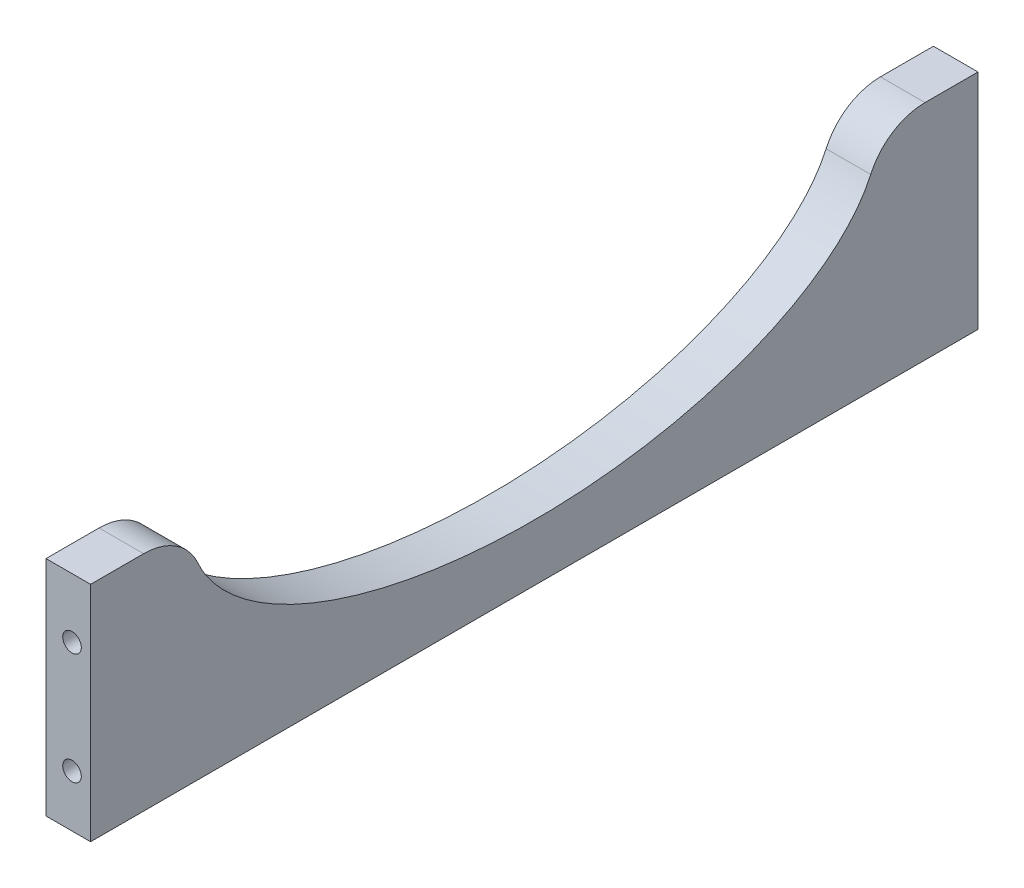
ISO-10303-21;
HEADER;
FILE_DESCRIPTION(('STEP AP214'),'2;1');
FILE_NAME('part.step','',(''),(''),'','','');
FILE_SCHEMA(('AUTOMOTIVE_DESIGN { 1 0 10303 214 1 1 1 1 }'));
ENDSEC;
DATA;
#1=APPLICATION_CONTEXT('core data for automotive mechanical design processes');
#2=APPLICATION_PROTOCOL_DEFINITION('international standard','automotive_design',2000,#1);
#3=PRODUCT_CONTEXT('',#1,'mechanical');
#4=PRODUCT('Part','Part','',(#3));
#5=PRODUCT_RELATED_PRODUCT_CATEGORY('part','',(#4));
#6=PRODUCT_DEFINITION_FORMATION('','',#4);
#7=PRODUCT_DEFINITION_CONTEXT('part definition',#1,'design');
#8=PRODUCT_DEFINITION('design','',#6,#7);
#9=PRODUCT_DEFINITION_SHAPE('','',#8);
#10=(LENGTH_UNIT() NAMED_UNIT(*) SI_UNIT(.MILLI.,.METRE.));
#11=(NAMED_UNIT(*) PLANE_ANGLE_UNIT() SI_UNIT($,.RADIAN.));
#12=(NAMED_UNIT(*) SI_UNIT($,.STERADIAN.) SOLID_ANGLE_UNIT());
#13=UNCERTAINTY_MEASURE_WITH_UNIT(LENGTH_MEASURE(1.E-05),#10,'distance_accuracy_value','');
#14=(GEOMETRIC_REPRESENTATION_CONTEXT(3) GLOBAL_UNCERTAINTY_ASSIGNED_CONTEXT((#13)) GLOBAL_UNIT_ASSIGNED_CONTEXT((#10,
#11,#12)) REPRESENTATION_CONTEXT('',''));
#15=CARTESIAN_POINT('',(0.,0.,0.));
#16=DIRECTION('',(0.,0.,1.));
#17=DIRECTION('',(1.,0.,0.));
#18=AXIS2_PLACEMENT_3D('',#15,#16,#17);
#19=CARTESIAN_POINT('',(-77.4,30.,149.994117081557));
#20=DIRECTION('',(0.,-1.,0.));
#21=DIRECTION('',(0.,0.,-1.));
#22=AXIS2_PLACEMENT_3D('',#19,#20,#21);
#23=PLANE('',#22);
#24=DIRECTION('',(0.,0.,-1.));
#25=VECTOR('',#24,1.);
#26=CARTESIAN_POINT('',(-77.4,30.,149.994117081557));
#27=LINE('',#26,#25);
#28=CARTESIAN_POINT('',(-77.4,30.,119.4));
#29=VERTEX_POINT('',#28);
#30=CARTESIAN_POINT('',(-77.4,30.,112.263898035396));
#31=VERTEX_POINT('',#30);
#32=EDGE_CURVE('E144',#29,#31,#27,.T.);
#33=ORIENTED_EDGE('',*,*,#32,.T.);
#34=DIRECTION('',(-1.,0.,0.));
#35=VECTOR('',#34,1.);
#36=CARTESIAN_POINT('',(-77.4,30.,112.263898035396));
#37=LINE('',#36,#35);
#38=CARTESIAN_POINT('',(-83.4,30.,112.263898035396));
#39=VERTEX_POINT('',#38);
#40=EDGE_CURVE('E113',#31,#39,#37,.T.);
#41=ORIENTED_EDGE('',*,*,#40,.T.);
#42=DIRECTION('',(0.,0.,-1.));
#43=VECTOR('',#42,1.);
#44=CARTESIAN_POINT('',(-83.4,30.,149.994117081557));
#45=LINE('',#44,#43);
#46=CARTESIAN_POINT('',(-83.4,30.,119.4));
#47=VERTEX_POINT('',#46);
#48=EDGE_CURVE('E106',#47,#39,#45,.T.);
#49=ORIENTED_EDGE('',*,*,#48,.F.);
#50=DIRECTION('',(-1.,0.,0.));
#51=VECTOR('',#50,1.);
#52=CARTESIAN_POINT('',(-77.4,30.,119.4));
#53=LINE('',#52,#51);
#54=EDGE_CURVE('E110',#29,#47,#53,.T.);
#55=ORIENTED_EDGE('',*,*,#54,.F.);
#56=EDGE_LOOP('',(#33,#41,#49,#55));
#57=FACE_BOUND('',#56,.T.);
#58=ADVANCED_FACE('F39',(#57),#23,.F.);
#59=CARTESIAN_POINT('',(-83.4,0.,149.994117081557));
#60=DIRECTION('',(0.,1.,0.));
#61=DIRECTION('',(0.,0.,1.));
#62=AXIS2_PLACEMENT_3D('',#59,#60,#61);
#63=PLANE('',#62);
#64=DIRECTION('',(1.,0.,0.));
#65=VECTOR('',#64,1.);
#66=CARTESIAN_POINT('',(-83.4,0.,119.4));
#67=LINE('',#66,#65);
#68=CARTESIAN_POINT('',(-83.4,0.,119.4));
#69=VERTEX_POINT('',#68);
#70=CARTESIAN_POINT('',(-77.4,0.,119.4));
#71=VERTEX_POINT('',#70);
#72=EDGE_CURVE('E126',#69,#71,#67,.T.);
#73=ORIENTED_EDGE('',*,*,#72,.F.);
#74=DIRECTION('',(0.,0.,-1.));
#75=VECTOR('',#74,1.);
#76=CARTESIAN_POINT('',(-83.4,0.,149.994117081557));
#77=LINE('',#76,#75);
#78=CARTESIAN_POINT('',(-83.4,0.,0.));
#79=VERTEX_POINT('',#78);
#80=EDGE_CURVE('E122',#69,#79,#77,.T.);
#81=ORIENTED_EDGE('',*,*,#80,.T.);
#82=DIRECTION('',(1.,0.,0.));
#83=VECTOR('',#82,1.);
#84=CARTESIAN_POINT('',(-83.4,0.,0.));
#85=LINE('',#84,#83);
#86=CARTESIAN_POINT('',(-77.4,0.,0.));
#87=VERTEX_POINT('',#86);
#88=EDGE_CURVE('E137',#79,#87,#85,.T.);
#89=ORIENTED_EDGE('',*,*,#88,.T.);
#90=DIRECTION('',(0.,0.,-1.));
#91=VECTOR('',#90,1.);
#92=CARTESIAN_POINT('',(-77.4,0.,149.994117081557));
#93=LINE('',#92,#91);
#94=EDGE_CURVE('E141',#71,#87,#93,.T.);
#95=ORIENTED_EDGE('',*,*,#94,.F.);
#96=EDGE_LOOP('',(#73,#81,#89,#95));
#97=FACE_BOUND('',#96,.T.);
#98=ADVANCED_FACE('F183',(#97),#63,.F.);
#99=CARTESIAN_POINT('',(-77.4,0.,149.994117081557));
#100=DIRECTION('',(-1.,0.,0.));
#101=DIRECTION('',(0.,0.,1.));
#102=AXIS2_PLACEMENT_3D('',#99,#100,#101);
#103=PLANE('',#102);
#104=CARTESIAN_POINT('',(-77.4,30.,59.7));
#105=DIRECTION('',(-1.,0.,0.));
#106=DIRECTION('',(0.,0.,1.));
#107=AXIS2_PLACEMENT_3D('',#104,#105,#106);
#108=ELLIPSE('',#107,46.3101540360164,22.3661899452335);
#109=CARTESIAN_POINT('',(-77.4,25.2705229007276,14.4370388877539));
#110=VERTEX_POINT('',#109);
#111=CARTESIAN_POINT('',(-77.4,25.2705229007276,104.962961112246));
#112=VERTEX_POINT('',#111);
#113=EDGE_CURVE('E148',#110,#112,#108,.T.);
#114=ORIENTED_EDGE('',*,*,#113,.T.);
#115=CARTESIAN_POINT('',(-77.4,22.0000000000001,112.263898035396));
#116=DIRECTION('',(-1.,0.,0.));
#117=DIRECTION('',(0.,0.,1.));
#118=AXIS2_PLACEMENT_3D('',#115,#116,#117);
#119=CIRCLE('',#118,8.);
#120=EDGE_CURVE('E47',#112,#31,#119,.F.);
#121=ORIENTED_EDGE('',*,*,#120,.T.);
#122=ORIENTED_EDGE('',*,*,#32,.F.);
#123=DIRECTION('',(0.,1.,0.));
#124=VECTOR('',#123,1.);
#125=CARTESIAN_POINT('',(-77.4,0.,119.4));
#126=LINE('',#125,#124);
#127=EDGE_CURVE('E130',#71,#29,#126,.T.);
#128=ORIENTED_EDGE('',*,*,#127,.F.);
#129=ORIENTED_EDGE('',*,*,#94,.T.);
#130=DIRECTION('',(0.,1.,0.));
#131=VECTOR('',#130,1.);
#132=CARTESIAN_POINT('',(-77.4,0.,0.));
#133=LINE('',#132,#131);
#134=CARTESIAN_POINT('',(-77.4,30.,0.));
#135=VERTEX_POINT('',#134);
#136=EDGE_CURVE('E143',#87,#135,#133,.T.);
#137=ORIENTED_EDGE('',*,*,#136,.T.);
#138=CARTESIAN_POINT('',(-77.4,30.,7.13610196460382));
#139=VERTEX_POINT('',#138);
#140=EDGE_CURVE('E146',#139,#135,#27,.T.);
#141=ORIENTED_EDGE('',*,*,#140,.F.);
#142=CARTESIAN_POINT('',(-77.4,22.0000000000001,7.13610196460382));
#143=DIRECTION('',(-1.,0.,0.));
#144=DIRECTION('',(0.,0.,1.));
#145=AXIS2_PLACEMENT_3D('',#142,#143,#144);
#146=CIRCLE('',#145,8.);
#147=EDGE_CURVE('E54',#139,#110,#146,.F.);
#148=ORIENTED_EDGE('',*,*,#147,.T.);
#149=EDGE_LOOP('',(#114,#121,#122,#128,#129,#137,#141,#148));
#150=FACE_BOUND('',#149,.T.);
#151=ADVANCED_FACE('F160',(#150),#103,.F.);
#152=CARTESIAN_POINT('',(-83.4,30.,7.13610196460382));
#153=VERTEX_POINT('',#152);
#154=CARTESIAN_POINT('',(-83.4,30.,0.));
#155=VERTEX_POINT('',#154);
#156=EDGE_CURVE('E116',#153,#155,#45,.T.);
#157=ORIENTED_EDGE('',*,*,#156,.F.);
#158=DIRECTION('',(-1.,0.,0.));
#159=VECTOR('',#158,1.);
#160=CARTESIAN_POINT('',(-77.4,30.,7.13610196460382));
#161=LINE('',#160,#159);
#162=EDGE_CURVE('E11',#153,#139,#161,.F.);
#163=ORIENTED_EDGE('',*,*,#162,.T.);
#164=ORIENTED_EDGE('',*,*,#140,.T.);
#165=DIRECTION('',(-1.,0.,0.));
#166=VECTOR('',#165,1.);
#167=CARTESIAN_POINT('',(-77.4,30.,0.));
#168=LINE('',#167,#166);
#169=EDGE_CURVE('E145',#135,#155,#168,.T.);
#170=ORIENTED_EDGE('',*,*,#169,.T.);
#171=EDGE_LOOP('',(#157,#163,#164,#170));
#172=FACE_BOUND('',#171,.T.);
#173=ADVANCED_FACE('F168',(#172),#23,.F.);
#174=CARTESIAN_POINT('',(-83.4,30.,149.994117081557));
#175=DIRECTION('',(1.,0.,0.));
#176=DIRECTION('',(0.,0.,-1.));
#177=AXIS2_PLACEMENT_3D('',#174,#175,#176);
#178=PLANE('',#177);
#179=ORIENTED_EDGE('',*,*,#48,.T.);
#180=CARTESIAN_POINT('',(-83.4,22.0000000000001,112.263898035396));
#181=DIRECTION('',(1.,0.,0.));
#182=DIRECTION('',(0.,0.,-1.));
#183=AXIS2_PLACEMENT_3D('',#180,#181,#182);
#184=CIRCLE('',#183,8.);
#185=CARTESIAN_POINT('',(-83.4,25.2705229007276,104.962961112246));
#186=VERTEX_POINT('',#185);
#187=EDGE_CURVE('E153',#39,#186,#184,.F.);
#188=ORIENTED_EDGE('',*,*,#187,.T.);
#189=CARTESIAN_POINT('',(-83.4,30.,59.7));
#190=DIRECTION('',(-1.,0.,0.));
#191=DIRECTION('',(0.,0.,1.));
#192=AXIS2_PLACEMENT_3D('',#189,#190,#191);
#193=ELLIPSE('',#192,46.3101540360164,22.3661899452335);
#194=CARTESIAN_POINT('',(-83.4,25.2705229007276,14.4370388877539));
#195=VERTEX_POINT('',#194);
#196=EDGE_CURVE('E131',#186,#195,#193,.F.);
#197=ORIENTED_EDGE('',*,*,#196,.T.);
#198=CARTESIAN_POINT('',(-83.4,22.0000000000001,7.13610196460382));
#199=DIRECTION('',(1.,0.,0.));
#200=DIRECTION('',(0.,0.,-1.));
#201=AXIS2_PLACEMENT_3D('',#198,#199,#200);
#202=CIRCLE('',#201,8.);
#203=EDGE_CURVE('E151',#195,#153,#202,.F.);
#204=ORIENTED_EDGE('',*,*,#203,.T.);
#205=ORIENTED_EDGE('',*,*,#156,.T.);
#206=DIRECTION('',(0.,-1.,0.));
#207=VECTOR('',#206,1.);
#208=CARTESIAN_POINT('',(-83.4,30.,0.));
#209=LINE('',#208,#207);
#210=EDGE_CURVE('E115',#155,#79,#209,.T.);
#211=ORIENTED_EDGE('',*,*,#210,.T.);
#212=ORIENTED_EDGE('',*,*,#80,.F.);
#213=DIRECTION('',(0.,-1.,0.));
#214=VECTOR('',#213,1.);
#215=CARTESIAN_POINT('',(-83.4,30.,119.4));
#216=LINE('',#215,#214);
#217=EDGE_CURVE('E119',#47,#69,#216,.T.);
#218=ORIENTED_EDGE('',*,*,#217,.F.);
#219=EDGE_LOOP('',(#179,#188,#197,#204,#205,#211,#212,#218));
#220=FACE_BOUND('',#219,.T.);
#221=ADVANCED_FACE('F120',(#220),#178,.F.);
#222=CARTESIAN_POINT('',(0.,0.,0.));
#223=DIRECTION('',(0.,0.,1.));
#224=DIRECTION('',(1.,0.,0.));
#225=AXIS2_PLACEMENT_3D('',#222,#223,#224);
#226=PLANE('',#225);
#227=CARTESIAN_POINT('',(-79.9,22.,0.));
#228=DIRECTION('',(0.,0.,-1.));
#229=DIRECTION('',(-1.,0.,0.));
#230=AXIS2_PLACEMENT_3D('',#227,#228,#229);
#231=CIRCLE('',#230,1.25);
#232=CARTESIAN_POINT('',(-81.15,22.,0.));
#233=VERTEX_POINT('',#232);
#234=EDGE_CURVE('E231',#233,#233,#231,.T.);
#235=ORIENTED_EDGE('',*,*,#234,.F.);
#236=EDGE_LOOP('',(#235));
#237=FACE_BOUND('',#236,.T.);
#238=CARTESIAN_POINT('',(-79.9,7.,0.));
#239=DIRECTION('',(0.,0.,-1.));
#240=DIRECTION('',(-1.,0.,0.));
#241=AXIS2_PLACEMENT_3D('',#238,#239,#240);
#242=CIRCLE('',#241,1.25);
#243=CARTESIAN_POINT('',(-81.15,7.,0.));
#244=VERTEX_POINT('',#243);
#245=EDGE_CURVE('E228',#244,#244,#242,.T.);
#246=ORIENTED_EDGE('',*,*,#245,.F.);
#247=EDGE_LOOP('',(#246));
#248=FACE_BOUND('',#247,.T.);
#249=ORIENTED_EDGE('',*,*,#88,.F.);
#250=ORIENTED_EDGE('',*,*,#210,.F.);
#251=ORIENTED_EDGE('',*,*,#169,.F.);
#252=ORIENTED_EDGE('',*,*,#136,.F.);
#253=EDGE_LOOP('',(#249,#250,#251,#252));
#254=FACE_BOUND('',#253,.T.);
#255=ADVANCED_FACE('F181',(#237,#248,#254),#226,.F.);
#256=CARTESIAN_POINT('',(-83.4,105.,119.4));
#257=DIRECTION('',(0.,0.,1.));
#258=DIRECTION('',(-1.,0.,0.));
#259=AXIS2_PLACEMENT_3D('',#256,#257,#258);
#260=PLANE('',#259);
#261=CARTESIAN_POINT('',(-79.9,22.,119.4));
#262=DIRECTION('',(0.,0.,1.));
#263=DIRECTION('',(1.,0.,0.));
#264=AXIS2_PLACEMENT_3D('',#261,#262,#263);
#265=CIRCLE('',#264,1.25);
#266=CARTESIAN_POINT('',(-78.65,22.,119.4));
#267=VERTEX_POINT('',#266);
#268=EDGE_CURVE('E220',#267,#267,#265,.T.);
#269=ORIENTED_EDGE('',*,*,#268,.F.);
#270=EDGE_LOOP('',(#269));
#271=FACE_BOUND('',#270,.T.);
#272=CARTESIAN_POINT('',(-79.9,7.,119.4));
#273=DIRECTION('',(0.,0.,1.));
#274=DIRECTION('',(1.,0.,0.));
#275=AXIS2_PLACEMENT_3D('',#272,#273,#274);
#276=CIRCLE('',#275,1.25);
#277=CARTESIAN_POINT('',(-78.65,7.,119.4));
#278=VERTEX_POINT('',#277);
#279=EDGE_CURVE('E216',#278,#278,#276,.T.);
#280=ORIENTED_EDGE('',*,*,#279,.F.);
#281=EDGE_LOOP('',(#280));
#282=FACE_BOUND('',#281,.T.);
#283=ORIENTED_EDGE('',*,*,#217,.T.);
#284=ORIENTED_EDGE('',*,*,#72,.T.);
#285=ORIENTED_EDGE('',*,*,#127,.T.);
#286=ORIENTED_EDGE('',*,*,#54,.T.);
#287=EDGE_LOOP('',(#283,#284,#285,#286));
#288=FACE_BOUND('',#287,.T.);
#289=ADVANCED_FACE('F129',(#271,#282,#288),#260,.T.);
#290=DIRECTION('',(-1.,0.,0.));
#291=VECTOR('',#290,1.);
#292=SURFACE_OF_LINEAR_EXTRUSION('',#108,#291);
#293=ORIENTED_EDGE('',*,*,#196,.F.);
#294=DIRECTION('',(-1.,0.,0.));
#295=VECTOR('',#294,1.);
#296=CARTESIAN_POINT('',(-83.4,25.2705229007276,104.962961112246));
#297=LINE('',#296,#295);
#298=EDGE_CURVE('E61',#186,#112,#297,.F.);
#299=ORIENTED_EDGE('',*,*,#298,.T.);
#300=ORIENTED_EDGE('',*,*,#113,.F.);
#301=DIRECTION('',(-1.,0.,0.));
#302=VECTOR('',#301,1.);
#303=CARTESIAN_POINT('',(-77.4,25.2705229007276,14.4370388877539));
#304=LINE('',#303,#302);
#305=EDGE_CURVE('E155',#110,#195,#304,.T.);
#306=ORIENTED_EDGE('',*,*,#305,.T.);
#307=EDGE_LOOP('',(#293,#299,#300,#306));
#308=FACE_BOUND('',#307,.T.);
#309=ADVANCED_FACE('F164',(#308),#292,.F.);
#310=CARTESIAN_POINT('',(-80.4,22.0000000000001,112.263898035396));
#311=DIRECTION('',(-1.,0.,0.));
#312=DIRECTION('',(0.,0.,1.));
#313=AXIS2_PLACEMENT_3D('',#310,#311,#312);
#314=CYLINDRICAL_SURFACE('',#313,8.);
#315=ORIENTED_EDGE('',*,*,#120,.F.);
#316=ORIENTED_EDGE('',*,*,#298,.F.);
#317=ORIENTED_EDGE('',*,*,#187,.F.);
#318=ORIENTED_EDGE('',*,*,#40,.F.);
#319=EDGE_LOOP('',(#315,#316,#317,#318));
#320=FACE_BOUND('',#319,.T.);
#321=ADVANCED_FACE('F162',(#320),#314,.T.);
#322=CARTESIAN_POINT('',(-80.4,22.0000000000001,7.13610196460382));
#323=DIRECTION('',(-1.,0.,0.));
#324=DIRECTION('',(0.,0.,1.));
#325=AXIS2_PLACEMENT_3D('',#322,#323,#324);
#326=CYLINDRICAL_SURFACE('',#325,8.);
#327=ORIENTED_EDGE('',*,*,#203,.F.);
#328=ORIENTED_EDGE('',*,*,#305,.F.);
#329=ORIENTED_EDGE('',*,*,#147,.F.);
#330=ORIENTED_EDGE('',*,*,#162,.F.);
#331=EDGE_LOOP('',(#327,#328,#329,#330));
#332=FACE_BOUND('',#331,.T.);
#333=ADVANCED_FACE('F41',(#332),#326,.T.);
#334=CARTESIAN_POINT('',(-79.9,7.,109.4));
#335=DIRECTION('',(0.,0.,1.));
#336=DIRECTION('',(1.,0.,0.));
#337=AXIS2_PLACEMENT_3D('',#334,#335,#336);
#338=CYLINDRICAL_SURFACE('',#337,1.25);
#339=CARTESIAN_POINT('',(-79.9,7.,109.4));
#340=DIRECTION('',(0.,0.,1.));
#341=DIRECTION('',(1.,0.,0.));
#342=AXIS2_PLACEMENT_3D('',#339,#340,#341);
#343=CIRCLE('',#342,1.25);
#344=CARTESIAN_POINT('',(-78.65,7.,109.4));
#345=VERTEX_POINT('',#344);
#346=EDGE_CURVE('E213',#345,#345,#343,.T.);
#347=ORIENTED_EDGE('',*,*,#346,.F.);
#348=EDGE_LOOP('',(#347));
#349=FACE_BOUND('',#348,.T.);
#350=ORIENTED_EDGE('',*,*,#279,.T.);
#351=EDGE_LOOP('',(#350));
#352=FACE_BOUND('',#351,.T.);
#353=ADVANCED_FACE('F200',(#349,#352),#338,.F.);
#354=CARTESIAN_POINT('',(-79.9,7.,109.4));
#355=DIRECTION('',(0.,0.,1.));
#356=DIRECTION('',(1.,0.,0.));
#357=AXIS2_PLACEMENT_3D('',#354,#355,#356);
#358=PLANE('',#357);
#359=ORIENTED_EDGE('',*,*,#346,.T.);
#360=EDGE_LOOP('',(#359));
#361=FACE_BOUND('',#360,.T.);
#362=ADVANCED_FACE('F207',(#361),#358,.T.);
#363=CARTESIAN_POINT('',(-79.9,22.,109.4));
#364=DIRECTION('',(0.,0.,1.));
#365=DIRECTION('',(1.,0.,0.));
#366=AXIS2_PLACEMENT_3D('',#363,#364,#365);
#367=CYLINDRICAL_SURFACE('',#366,1.25);
#368=CARTESIAN_POINT('',(-79.9,22.,109.4));
#369=DIRECTION('',(0.,0.,1.));
#370=DIRECTION('',(1.,0.,0.));
#371=AXIS2_PLACEMENT_3D('',#368,#369,#370);
#372=CIRCLE('',#371,1.25);
#373=CARTESIAN_POINT('',(-78.65,22.,109.4));
#374=VERTEX_POINT('',#373);
#375=EDGE_CURVE('E212',#374,#374,#372,.T.);
#376=ORIENTED_EDGE('',*,*,#375,.F.);
#377=EDGE_LOOP('',(#376));
#378=FACE_BOUND('',#377,.T.);
#379=ORIENTED_EDGE('',*,*,#268,.T.);
#380=EDGE_LOOP('',(#379));
#381=FACE_BOUND('',#380,.T.);
#382=ADVANCED_FACE('F261',(#378,#381),#367,.F.);
#383=CARTESIAN_POINT('',(-79.9,22.,109.4));
#384=DIRECTION('',(0.,0.,1.));
#385=DIRECTION('',(1.,0.,0.));
#386=AXIS2_PLACEMENT_3D('',#383,#384,#385);
#387=PLANE('',#386);
#388=ORIENTED_EDGE('',*,*,#375,.T.);
#389=EDGE_LOOP('',(#388));
#390=FACE_BOUND('',#389,.T.);
#391=ADVANCED_FACE('F252',(#390),#387,.T.);
#392=CARTESIAN_POINT('',(-79.9,7.,10.));
#393=DIRECTION('',(0.,0.,-1.));
#394=DIRECTION('',(-1.,0.,0.));
#395=AXIS2_PLACEMENT_3D('',#392,#393,#394);
#396=CYLINDRICAL_SURFACE('',#395,1.25);
#397=CARTESIAN_POINT('',(-79.9,7.,10.));
#398=DIRECTION('',(0.,0.,-1.));
#399=DIRECTION('',(-1.,0.,0.));
#400=AXIS2_PLACEMENT_3D('',#397,#398,#399);
#401=CIRCLE('',#400,1.25);
#402=CARTESIAN_POINT('',(-81.15,7.,10.));
#403=VERTEX_POINT('',#402);
#404=EDGE_CURVE('E225',#403,#403,#401,.T.);
#405=ORIENTED_EDGE('',*,*,#404,.F.);
#406=EDGE_LOOP('',(#405));
#407=FACE_BOUND('',#406,.T.);
#408=ORIENTED_EDGE('',*,*,#245,.T.);
#409=EDGE_LOOP('',(#408));
#410=FACE_BOUND('',#409,.T.);
#411=ADVANCED_FACE('F250',(#407,#410),#396,.F.);
#412=CARTESIAN_POINT('',(-79.9,7.,10.));
#413=DIRECTION('',(0.,0.,-1.));
#414=DIRECTION('',(-1.,0.,0.));
#415=AXIS2_PLACEMENT_3D('',#412,#413,#414);
#416=PLANE('',#415);
#417=ORIENTED_EDGE('',*,*,#404,.T.);
#418=EDGE_LOOP('',(#417));
#419=FACE_BOUND('',#418,.T.);
#420=ADVANCED_FACE('F242',(#419),#416,.T.);
#421=CARTESIAN_POINT('',(-79.9,22.,10.));
#422=DIRECTION('',(0.,0.,-1.));
#423=DIRECTION('',(-1.,0.,0.));
#424=AXIS2_PLACEMENT_3D('',#421,#422,#423);
#425=CYLINDRICAL_SURFACE('',#424,1.25);
#426=CARTESIAN_POINT('',(-79.9,22.,10.));
#427=DIRECTION('',(0.,0.,-1.));
#428=DIRECTION('',(-1.,0.,0.));
#429=AXIS2_PLACEMENT_3D('',#426,#427,#428);
#430=CIRCLE('',#429,1.25);
#431=CARTESIAN_POINT('',(-81.15,22.,10.));
#432=VERTEX_POINT('',#431);
#433=EDGE_CURVE('E217',#432,#432,#430,.T.);
#434=ORIENTED_EDGE('',*,*,#433,.F.);
#435=EDGE_LOOP('',(#434));
#436=FACE_BOUND('',#435,.T.);
#437=ORIENTED_EDGE('',*,*,#234,.T.);
#438=EDGE_LOOP('',(#437));
#439=FACE_BOUND('',#438,.T.);
#440=ADVANCED_FACE('F239',(#436,#439),#425,.F.);
#441=CARTESIAN_POINT('',(-79.9,22.,10.));
#442=DIRECTION('',(0.,0.,-1.));
#443=DIRECTION('',(-1.,0.,0.));
#444=AXIS2_PLACEMENT_3D('',#441,#442,#443);
#445=PLANE('',#444);
#446=ORIENTED_EDGE('',*,*,#433,.T.);
#447=EDGE_LOOP('',(#446));
#448=FACE_BOUND('',#447,.T.);
#449=ADVANCED_FACE('F237',(#448),#445,.T.);
#450=CLOSED_SHELL('',(#58,#98,#151,#173,#221,#255,#289,#309,#321,#333,#353,#362,#382,#391,#411,
#420,#440,#449));
#451=MANIFOLD_SOLID_BREP('B2',#450);
#452=ADVANCED_BREP_SHAPE_REPRESENTATION('',(#18,#451),#14);
#453=SHAPE_DEFINITION_REPRESENTATION(#9,#452);
ENDSEC;
END-ISO-10303-21;
